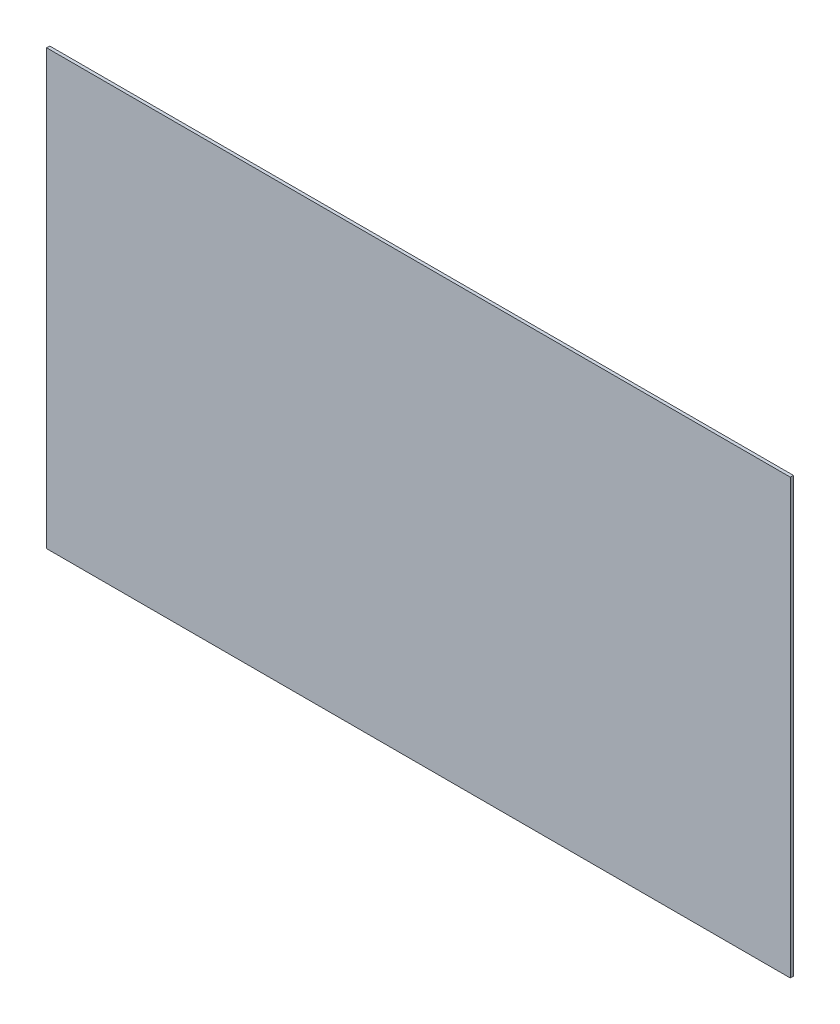
ISO-10303-21;
HEADER;
FILE_DESCRIPTION(('STEP AP214'),'2;1');
FILE_NAME('part.step','',(''),(''),'','','');
FILE_SCHEMA(('AUTOMOTIVE_DESIGN { 1 0 10303 214 1 1 1 1 }'));
ENDSEC;
DATA;
#1=APPLICATION_CONTEXT('core data for automotive mechanical design processes');
#2=APPLICATION_PROTOCOL_DEFINITION('international standard','automotive_design',2000,#1);
#3=PRODUCT_CONTEXT('',#1,'mechanical');
#4=PRODUCT('Part','Part','',(#3));
#5=PRODUCT_RELATED_PRODUCT_CATEGORY('part','',(#4));
#6=PRODUCT_DEFINITION_FORMATION('','',#4);
#7=PRODUCT_DEFINITION_CONTEXT('part definition',#1,'design');
#8=PRODUCT_DEFINITION('design','',#6,#7);
#9=PRODUCT_DEFINITION_SHAPE('','',#8);
#10=(LENGTH_UNIT() NAMED_UNIT(*) SI_UNIT(.MILLI.,.METRE.));
#11=(NAMED_UNIT(*) PLANE_ANGLE_UNIT() SI_UNIT($,.RADIAN.));
#12=(NAMED_UNIT(*) SI_UNIT($,.STERADIAN.) SOLID_ANGLE_UNIT());
#13=UNCERTAINTY_MEASURE_WITH_UNIT(LENGTH_MEASURE(1.E-05),#10,'distance_accuracy_value','');
#14=(GEOMETRIC_REPRESENTATION_CONTEXT(3) GLOBAL_UNCERTAINTY_ASSIGNED_CONTEXT((#13)) GLOBAL_UNIT_ASSIGNED_CONTEXT((#10,
#11,#12)) REPRESENTATION_CONTEXT('',''));
#15=CARTESIAN_POINT('',(0.,0.,0.));
#16=DIRECTION('',(0.,0.,1.));
#17=DIRECTION('',(1.,0.,0.));
#18=AXIS2_PLACEMENT_3D('',#15,#16,#17);
#19=CARTESIAN_POINT('',(-360.,210.,3.));
#20=DIRECTION('',(1.,0.,0.));
#21=DIRECTION('',(0.,1.,0.));
#22=AXIS2_PLACEMENT_3D('',#19,#20,#21);
#23=PLANE('',#22);
#24=DIRECTION('',(0.,-1.,0.));
#25=VECTOR('',#24,1.);
#26=CARTESIAN_POINT('',(-360.,210.,0.));
#27=LINE('',#26,#25);
#28=CARTESIAN_POINT('',(-360.,210.,0.));
#29=VERTEX_POINT('',#28);
#30=CARTESIAN_POINT('',(-360.,-210.,0.));
#31=VERTEX_POINT('',#30);
#32=EDGE_CURVE('E96',#29,#31,#27,.T.);
#33=ORIENTED_EDGE('',*,*,#32,.T.);
#34=DIRECTION('',(0.,0.,-1.));
#35=VECTOR('',#34,1.);
#36=CARTESIAN_POINT('',(-360.,-210.,3.));
#37=LINE('',#36,#35);
#38=CARTESIAN_POINT('',(-360.,-210.,3.));
#39=VERTEX_POINT('',#38);
#40=EDGE_CURVE('E11',#39,#31,#37,.T.);
#41=ORIENTED_EDGE('',*,*,#40,.F.);
#42=DIRECTION('',(0.,-1.,0.));
#43=VECTOR('',#42,1.);
#44=CARTESIAN_POINT('',(-360.,210.,3.));
#45=LINE('',#44,#43);
#46=CARTESIAN_POINT('',(-360.,210.,3.));
#47=VERTEX_POINT('',#46);
#48=EDGE_CURVE('E84',#47,#39,#45,.T.);
#49=ORIENTED_EDGE('',*,*,#48,.F.);
#50=DIRECTION('',(0.,0.,-1.));
#51=VECTOR('',#50,1.);
#52=CARTESIAN_POINT('',(-360.,210.,3.));
#53=LINE('',#52,#51);
#54=EDGE_CURVE('E92',#47,#29,#53,.T.);
#55=ORIENTED_EDGE('',*,*,#54,.T.);
#56=EDGE_LOOP('',(#33,#41,#49,#55));
#57=FACE_BOUND('',#56,.T.);
#58=ADVANCED_FACE('F33',(#57),#23,.F.);
#59=CARTESIAN_POINT('',(-360.,-210.,3.));
#60=DIRECTION('',(0.,1.,0.));
#61=DIRECTION('',(0.,0.,1.));
#62=AXIS2_PLACEMENT_3D('',#59,#60,#61);
#63=PLANE('',#62);
#64=DIRECTION('',(1.,0.,0.));
#65=VECTOR('',#64,1.);
#66=CARTESIAN_POINT('',(-360.,-210.,0.));
#67=LINE('',#66,#65);
#68=CARTESIAN_POINT('',(360.,-210.,0.));
#69=VERTEX_POINT('',#68);
#70=EDGE_CURVE('E88',#31,#69,#67,.T.);
#71=ORIENTED_EDGE('',*,*,#70,.T.);
#72=DIRECTION('',(0.,0.,-1.));
#73=VECTOR('',#72,1.);
#74=CARTESIAN_POINT('',(360.,-210.,3.));
#75=LINE('',#74,#73);
#76=CARTESIAN_POINT('',(360.,-210.,3.));
#77=VERTEX_POINT('',#76);
#78=EDGE_CURVE('E41',#77,#69,#75,.T.);
#79=ORIENTED_EDGE('',*,*,#78,.F.);
#80=DIRECTION('',(1.,0.,0.));
#81=VECTOR('',#80,1.);
#82=CARTESIAN_POINT('',(-360.,-210.,3.));
#83=LINE('',#82,#81);
#84=EDGE_CURVE('E79',#39,#77,#83,.T.);
#85=ORIENTED_EDGE('',*,*,#84,.F.);
#86=ORIENTED_EDGE('',*,*,#40,.T.);
#87=EDGE_LOOP('',(#71,#79,#85,#86));
#88=FACE_BOUND('',#87,.T.);
#89=ADVANCED_FACE('F87',(#88),#63,.F.);
#90=CARTESIAN_POINT('',(360.,210.,3.));
#91=DIRECTION('',(-1.,0.,0.));
#92=DIRECTION('',(0.,0.,1.));
#93=AXIS2_PLACEMENT_3D('',#90,#91,#92);
#94=PLANE('',#93);
#95=DIRECTION('',(0.,1.,0.));
#96=VECTOR('',#95,1.);
#97=CARTESIAN_POINT('',(360.,210.,0.));
#98=LINE('',#97,#96);
#99=CARTESIAN_POINT('',(360.,210.,0.));
#100=VERTEX_POINT('',#99);
#101=EDGE_CURVE('E66',#69,#100,#98,.T.);
#102=ORIENTED_EDGE('',*,*,#101,.T.);
#103=DIRECTION('',(0.,0.,-1.));
#104=VECTOR('',#103,1.);
#105=CARTESIAN_POINT('',(360.,210.,3.));
#106=LINE('',#105,#104);
#107=CARTESIAN_POINT('',(360.,210.,3.));
#108=VERTEX_POINT('',#107);
#109=EDGE_CURVE('E89',#108,#100,#106,.T.);
#110=ORIENTED_EDGE('',*,*,#109,.F.);
#111=DIRECTION('',(0.,1.,0.));
#112=VECTOR('',#111,1.);
#113=CARTESIAN_POINT('',(360.,210.,3.));
#114=LINE('',#113,#112);
#115=EDGE_CURVE('E82',#77,#108,#114,.T.);
#116=ORIENTED_EDGE('',*,*,#115,.F.);
#117=ORIENTED_EDGE('',*,*,#78,.T.);
#118=EDGE_LOOP('',(#102,#110,#116,#117));
#119=FACE_BOUND('',#118,.T.);
#120=ADVANCED_FACE('F90',(#119),#94,.F.);
#121=CARTESIAN_POINT('',(-360.,210.,3.));
#122=DIRECTION('',(0.,-1.,0.));
#123=DIRECTION('',(0.,0.,-1.));
#124=AXIS2_PLACEMENT_3D('',#121,#122,#123);
#125=PLANE('',#124);
#126=DIRECTION('',(-1.,0.,0.));
#127=VECTOR('',#126,1.);
#128=CARTESIAN_POINT('',(-360.,210.,0.));
#129=LINE('',#128,#127);
#130=EDGE_CURVE('E72',#100,#29,#129,.T.);
#131=ORIENTED_EDGE('',*,*,#130,.T.);
#132=ORIENTED_EDGE('',*,*,#54,.F.);
#133=DIRECTION('',(-1.,0.,0.));
#134=VECTOR('',#133,1.);
#135=CARTESIAN_POINT('',(-360.,210.,3.));
#136=LINE('',#135,#134);
#137=EDGE_CURVE('E49',#108,#47,#136,.T.);
#138=ORIENTED_EDGE('',*,*,#137,.F.);
#139=ORIENTED_EDGE('',*,*,#109,.T.);
#140=EDGE_LOOP('',(#131,#132,#138,#139));
#141=FACE_BOUND('',#140,.T.);
#142=ADVANCED_FACE('F103',(#141),#125,.F.);
#143=CARTESIAN_POINT('',(0.,0.,3.));
#144=DIRECTION('',(0.,0.,1.));
#145=DIRECTION('',(1.,0.,0.));
#146=AXIS2_PLACEMENT_3D('',#143,#144,#145);
#147=PLANE('',#146);
#148=ORIENTED_EDGE('',*,*,#48,.T.);
#149=ORIENTED_EDGE('',*,*,#84,.T.);
#150=ORIENTED_EDGE('',*,*,#115,.T.);
#151=ORIENTED_EDGE('',*,*,#137,.T.);
#152=EDGE_LOOP('',(#148,#149,#150,#151));
#153=FACE_BOUND('',#152,.T.);
#154=ADVANCED_FACE('F80',(#153),#147,.T.);
#155=CARTESIAN_POINT('',(0.,0.,0.));
#156=DIRECTION('',(0.,0.,1.));
#157=DIRECTION('',(1.,0.,0.));
#158=AXIS2_PLACEMENT_3D('',#155,#156,#157);
#159=PLANE('',#158);
#160=ORIENTED_EDGE('',*,*,#32,.F.);
#161=ORIENTED_EDGE('',*,*,#130,.F.);
#162=ORIENTED_EDGE('',*,*,#101,.F.);
#163=ORIENTED_EDGE('',*,*,#70,.F.);
#164=EDGE_LOOP('',(#160,#161,#162,#163));
#165=FACE_BOUND('',#164,.T.);
#166=ADVANCED_FACE('F106',(#165),#159,.F.);
#167=CLOSED_SHELL('',(#58,#89,#120,#142,#154,#166));
#168=MANIFOLD_SOLID_BREP('B2',#167);
#169=ADVANCED_BREP_SHAPE_REPRESENTATION('',(#18,#168),#14);
#170=SHAPE_DEFINITION_REPRESENTATION(#9,#169);
ENDSEC;
END-ISO-10303-21;
